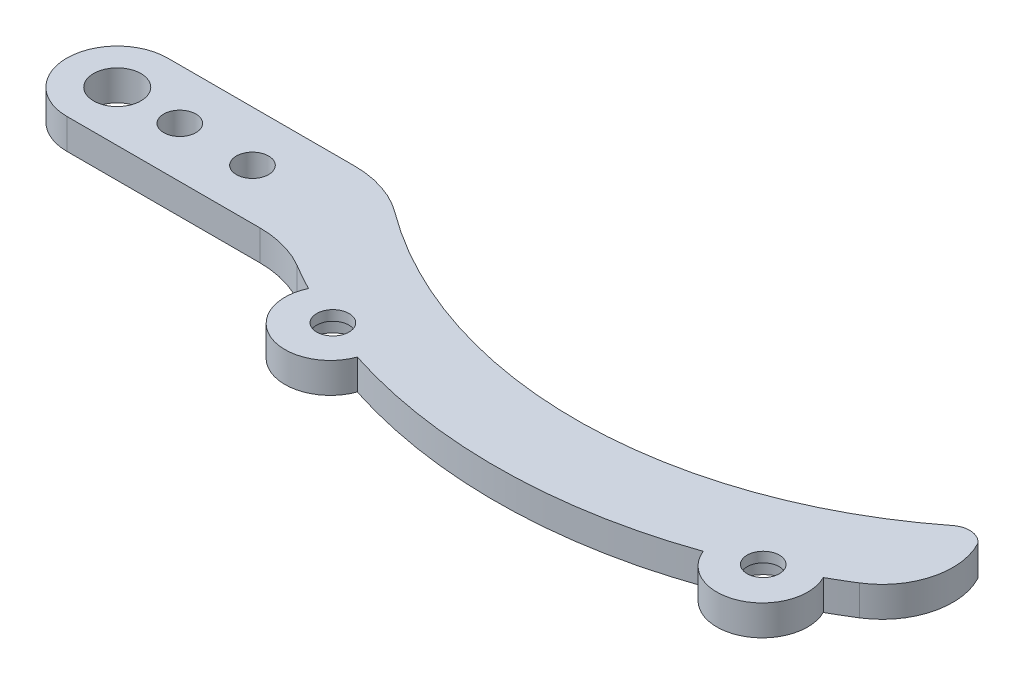
ISO-10303-21;
HEADER;
FILE_DESCRIPTION(('STEP AP214'),'2;1');
FILE_NAME('part.step','',(''),(''),'','','');
FILE_SCHEMA(('AUTOMOTIVE_DESIGN { 1 0 10303 214 1 1 1 1 }'));
ENDSEC;
DATA;
#1=APPLICATION_CONTEXT('core data for automotive mechanical design processes');
#2=APPLICATION_PROTOCOL_DEFINITION('international standard','automotive_design',2000,#1);
#3=PRODUCT_CONTEXT('',#1,'mechanical');
#4=PRODUCT('Part','Part','',(#3));
#5=PRODUCT_RELATED_PRODUCT_CATEGORY('part','',(#4));
#6=PRODUCT_DEFINITION_FORMATION('','',#4);
#7=PRODUCT_DEFINITION_CONTEXT('part definition',#1,'design');
#8=PRODUCT_DEFINITION('design','',#6,#7);
#9=PRODUCT_DEFINITION_SHAPE('','',#8);
#10=(LENGTH_UNIT() NAMED_UNIT(*) SI_UNIT(.MILLI.,.METRE.));
#11=(NAMED_UNIT(*) PLANE_ANGLE_UNIT() SI_UNIT($,.RADIAN.));
#12=(NAMED_UNIT(*) SI_UNIT($,.STERADIAN.) SOLID_ANGLE_UNIT());
#13=UNCERTAINTY_MEASURE_WITH_UNIT(LENGTH_MEASURE(1.E-05),#10,'distance_accuracy_value','');
#14=(GEOMETRIC_REPRESENTATION_CONTEXT(3) GLOBAL_UNCERTAINTY_ASSIGNED_CONTEXT((#13)) GLOBAL_UNIT_ASSIGNED_CONTEXT((#10,
#11,#12)) REPRESENTATION_CONTEXT('',''));
#15=CARTESIAN_POINT('',(0.,0.,0.));
#16=DIRECTION('',(0.,0.,1.));
#17=DIRECTION('',(1.,0.,0.));
#18=AXIS2_PLACEMENT_3D('',#15,#16,#17);
#19=CARTESIAN_POINT('',(1.89468168683698,-2.68774619760135,8.78806167188539));
#20=DIRECTION('',(0.,1.,0.));
#21=DIRECTION('',(0.,0.,-1.));
#22=AXIS2_PLACEMENT_3D('',#19,#20,#21);
#23=CYLINDRICAL_SURFACE('',#22,4.99999999999993);
#24=CARTESIAN_POINT('',(1.89468168683698,0.312253802398646,8.78806167188539));
#25=DIRECTION('',(0.,1.,0.));
#26=DIRECTION('',(0.,0.,1.));
#27=AXIS2_PLACEMENT_3D('',#24,#25,#26);
#28=CIRCLE('',#27,4.99999999999993);
#29=CARTESIAN_POINT('',(1.89468168683698,0.312253802398646,13.7880616718853));
#30=VERTEX_POINT('',#29);
#31=CARTESIAN_POINT('',(1.89468168683699,0.312253802398646,3.78806167188539));
#32=VERTEX_POINT('',#31);
#33=EDGE_CURVE('E208',#30,#32,#28,.F.);
#34=ORIENTED_EDGE('',*,*,#33,.T.);
#35=DIRECTION('',(0.,1.,0.));
#36=VECTOR('',#35,1.);
#37=CARTESIAN_POINT('',(1.89468168683699,-2.68774619760135,3.78806167188539));
#38=LINE('',#37,#36);
#39=CARTESIAN_POINT('',(1.89468168683699,-2.68774619760135,3.78806167188539));
#40=VERTEX_POINT('',#39);
#41=EDGE_CURVE('E166',#40,#32,#38,.T.);
#42=ORIENTED_EDGE('',*,*,#41,.F.);
#43=CARTESIAN_POINT('',(1.89468168683698,-2.68774619760135,8.78806167188539));
#44=DIRECTION('',(0.,1.,0.));
#45=DIRECTION('',(0.,0.,1.));
#46=AXIS2_PLACEMENT_3D('',#43,#44,#45);
#47=CIRCLE('',#46,4.99999999999993);
#48=CARTESIAN_POINT('',(1.89468168683698,-2.68774619760135,13.7880616718853));
#49=VERTEX_POINT('',#48);
#50=EDGE_CURVE('E143',#49,#40,#47,.F.);
#51=ORIENTED_EDGE('',*,*,#50,.F.);
#52=DIRECTION('',(0.,1.,0.));
#53=VECTOR('',#52,1.);
#54=CARTESIAN_POINT('',(1.89468168683698,-2.68774619760135,13.7880616718853));
#55=LINE('',#54,#53);
#56=EDGE_CURVE('E154',#49,#30,#55,.T.);
#57=ORIENTED_EDGE('',*,*,#56,.T.);
#58=EDGE_LOOP('',(#34,#42,#51,#57));
#59=FACE_BOUND('',#58,.T.);
#60=ADVANCED_FACE('F43',(#59),#23,.T.);
#61=CARTESIAN_POINT('',(0.,-2.68774619760135,13.7880616718853));
#62=DIRECTION('',(0.,0.,-1.));
#63=DIRECTION('',(1.,0.,0.));
#64=AXIS2_PLACEMENT_3D('',#61,#62,#63);
#65=PLANE('',#64);
#66=DIRECTION('',(1.,0.,0.));
#67=VECTOR('',#66,1.);
#68=CARTESIAN_POINT('',(0.,0.312253802398646,13.7880616718853));
#69=LINE('',#68,#67);
#70=CARTESIAN_POINT('',(21.026425844856,0.312253802398646,13.7880616718853));
#71=VERTEX_POINT('',#70);
#72=EDGE_CURVE('E157',#30,#71,#69,.T.);
#73=ORIENTED_EDGE('',*,*,#72,.F.);
#74=ORIENTED_EDGE('',*,*,#56,.F.);
#75=DIRECTION('',(1.,0.,0.));
#76=VECTOR('',#75,1.);
#77=CARTESIAN_POINT('',(0.,-2.68774619760135,13.7880616718853));
#78=LINE('',#77,#76);
#79=CARTESIAN_POINT('',(21.026425844856,-2.68774619760135,13.7880616718853));
#80=VERTEX_POINT('',#79);
#81=EDGE_CURVE('E137',#49,#80,#78,.T.);
#82=ORIENTED_EDGE('',*,*,#81,.T.);
#83=DIRECTION('',(0.,1.,0.));
#84=VECTOR('',#83,1.);
#85=CARTESIAN_POINT('',(21.026425844856,-2.68774619760135,13.7880616718853));
#86=LINE('',#85,#84);
#87=EDGE_CURVE('E262',#71,#80,#86,.F.);
#88=ORIENTED_EDGE('',*,*,#87,.F.);
#89=EDGE_LOOP('',(#73,#74,#82,#88));
#90=FACE_BOUND('',#89,.T.);
#91=ADVANCED_FACE('F155',(#90),#65,.F.);
#92=CARTESIAN_POINT('',(53.1412199435257,-2.68774619760135,-30.4119383281152));
#93=DIRECTION('',(0.,1.,0.));
#94=DIRECTION('',(0.,0.,-1.));
#95=AXIS2_PLACEMENT_3D('',#92,#93,#94);
#96=CYLINDRICAL_SURFACE('',#95,53.);
#97=CARTESIAN_POINT('',(53.1412199435257,-2.68774619760135,-30.4119383281152));
#98=DIRECTION('',(0.,1.,0.));
#99=DIRECTION('',(0.,0.,1.));
#100=AXIS2_PLACEMENT_3D('',#97,#98,#99);
#101=CIRCLE('',#100,53.);
#102=CARTESIAN_POINT('',(28.6425882264622,-2.68774619760135,16.5861152910688));
#103=VERTEX_POINT('',#102);
#104=CARTESIAN_POINT('',(26.1240122097242,-2.68774619760135,15.1848870687106));
#105=VERTEX_POINT('',#104);
#106=EDGE_CURVE('E151',#103,#105,#101,.F.);
#107=ORIENTED_EDGE('',*,*,#106,.F.);
#108=DIRECTION('',(0.,1.,0.));
#109=VECTOR('',#108,1.);
#110=CARTESIAN_POINT('',(28.6425882264622,-2.68774619760135,16.5861152910688));
#111=LINE('',#110,#109);
#112=CARTESIAN_POINT('',(28.6425882264622,0.312253802398646,16.5861152910688));
#113=VERTEX_POINT('',#112);
#114=EDGE_CURVE('E163',#103,#113,#111,.T.);
#115=ORIENTED_EDGE('',*,*,#114,.T.);
#116=CARTESIAN_POINT('',(53.1412199435257,0.312253802398646,-30.4119383281152));
#117=DIRECTION('',(0.,1.,0.));
#118=DIRECTION('',(0.,0.,1.));
#119=AXIS2_PLACEMENT_3D('',#116,#117,#118);
#120=CIRCLE('',#119,53.);
#121=CARTESIAN_POINT('',(26.1240122097242,0.312253802398646,15.1848870687106));
#122=VERTEX_POINT('',#121);
#123=EDGE_CURVE('E214',#113,#122,#120,.F.);
#124=ORIENTED_EDGE('',*,*,#123,.T.);
#125=DIRECTION('',(0.,1.,0.));
#126=VECTOR('',#125,1.);
#127=CARTESIAN_POINT('',(26.1240122097242,-2.68774619760135,15.1848870687106));
#128=LINE('',#127,#126);
#129=EDGE_CURVE('E162',#105,#122,#128,.T.);
#130=ORIENTED_EDGE('',*,*,#129,.F.);
#131=EDGE_LOOP('',(#107,#115,#124,#130));
#132=FACE_BOUND('',#131,.T.);
#133=ADVANCED_FACE('F322',(#132),#96,.T.);
#134=CARTESIAN_POINT('',(32.7176965131315,-2.68774619760135,18.4949087455629));
#135=DIRECTION('',(0.,1.,0.));
#136=DIRECTION('',(0.,0.,-1.));
#137=AXIS2_PLACEMENT_3D('',#134,#135,#136);
#138=CYLINDRICAL_SURFACE('',#137,4.5);
#139=CARTESIAN_POINT('',(32.7176965131315,0.312253802398646,18.4949087455629));
#140=DIRECTION('',(0.,1.,0.));
#141=DIRECTION('',(0.,0.,1.));
#142=AXIS2_PLACEMENT_3D('',#139,#140,#141);
#143=CIRCLE('',#142,4.5);
#144=CARTESIAN_POINT('',(36.9400373912801,0.312253802398646,20.0511341497751));
#145=VERTEX_POINT('',#144);
#146=EDGE_CURVE('E218',#145,#113,#143,.F.);
#147=ORIENTED_EDGE('',*,*,#146,.T.);
#148=ORIENTED_EDGE('',*,*,#114,.F.);
#149=CARTESIAN_POINT('',(32.7176965131315,-2.68774619760135,18.4949087455629));
#150=DIRECTION('',(0.,1.,0.));
#151=DIRECTION('',(0.,0.,1.));
#152=AXIS2_PLACEMENT_3D('',#149,#150,#151);
#153=CIRCLE('',#152,4.5);
#154=CARTESIAN_POINT('',(36.9400373912801,-2.68774619760135,20.0511341497751));
#155=VERTEX_POINT('',#154);
#156=EDGE_CURVE('E180',#155,#103,#153,.F.);
#157=ORIENTED_EDGE('',*,*,#156,.F.);
#158=DIRECTION('',(0.,1.,0.));
#159=VECTOR('',#158,1.);
#160=CARTESIAN_POINT('',(36.9400373912801,-2.68774619760135,20.0511341497751));
#161=LINE('',#160,#159);
#162=EDGE_CURVE('E252',#155,#145,#161,.T.);
#163=ORIENTED_EDGE('',*,*,#162,.T.);
#164=EDGE_LOOP('',(#147,#148,#157,#163));
#165=FACE_BOUND('',#164,.T.);
#166=ADVANCED_FACE('F317',(#165),#138,.T.);
#167=CARTESIAN_POINT('',(70.7450649674562,0.312253802398646,19.5791072738067));
#168=VERTEX_POINT('',#167);
#169=EDGE_CURVE('E220',#168,#145,#120,.F.);
#170=ORIENTED_EDGE('',*,*,#169,.T.);
#171=ORIENTED_EDGE('',*,*,#162,.F.);
#172=CARTESIAN_POINT('',(70.7450649674562,-2.68774619760135,19.5791072738067));
#173=VERTEX_POINT('',#172);
#174=EDGE_CURVE('E182',#173,#155,#101,.F.);
#175=ORIENTED_EDGE('',*,*,#174,.F.);
#176=DIRECTION('',(0.,1.,0.));
#177=VECTOR('',#176,1.);
#178=CARTESIAN_POINT('',(70.7450649674562,-2.68774619760135,19.5791072738067));
#179=LINE('',#178,#177);
#180=EDGE_CURVE('E248',#173,#168,#179,.T.);
#181=ORIENTED_EDGE('',*,*,#180,.T.);
#182=EDGE_LOOP('',(#170,#171,#175,#181));
#183=FACE_BOUND('',#182,.T.);
#184=ADVANCED_FACE('F313',(#183),#96,.T.);
#185=CARTESIAN_POINT('',(74.922308346537,-2.68774619760135,17.905596666752));
#186=DIRECTION('',(0.,1.,0.));
#187=DIRECTION('',(0.,0.,-1.));
#188=AXIS2_PLACEMENT_3D('',#185,#186,#187);
#189=CYLINDRICAL_SURFACE('',#188,4.5);
#190=CARTESIAN_POINT('',(74.922308346537,0.312253802398646,17.905596666752));
#191=DIRECTION('',(0.,1.,0.));
#192=DIRECTION('',(0.,0.,1.));
#193=AXIS2_PLACEMENT_3D('',#190,#191,#192);
#194=CIRCLE('',#193,4.5);
#195=CARTESIAN_POINT('',(78.9425324873975,0.312253802398646,15.8837663431979));
#196=VERTEX_POINT('',#195);
#197=EDGE_CURVE('E223',#168,#196,#194,.T.);
#198=ORIENTED_EDGE('',*,*,#197,.F.);
#199=ORIENTED_EDGE('',*,*,#180,.F.);
#200=CARTESIAN_POINT('',(74.922308346537,-2.68774619760135,17.905596666752));
#201=DIRECTION('',(0.,1.,0.));
#202=DIRECTION('',(0.,0.,1.));
#203=AXIS2_PLACEMENT_3D('',#200,#201,#202);
#204=CIRCLE('',#203,4.5);
#205=CARTESIAN_POINT('',(78.9425324873975,-2.68774619760135,15.8837663431979));
#206=VERTEX_POINT('',#205);
#207=EDGE_CURVE('E185',#173,#206,#204,.T.);
#208=ORIENTED_EDGE('',*,*,#207,.T.);
#209=DIRECTION('',(0.,1.,0.));
#210=VECTOR('',#209,1.);
#211=CARTESIAN_POINT('',(78.9425324873975,-2.68774619760135,15.8837663431979));
#212=LINE('',#211,#210);
#213=EDGE_CURVE('E244',#206,#196,#212,.T.);
#214=ORIENTED_EDGE('',*,*,#213,.T.);
#215=EDGE_LOOP('',(#198,#199,#208,#214));
#216=FACE_BOUND('',#215,.T.);
#217=ADVANCED_FACE('F438',(#216),#189,.T.);
#218=CARTESIAN_POINT('',(81.2107590333428,0.312253802398646,14.5447183011898));
#219=VERTEX_POINT('',#218);
#220=EDGE_CURVE('E219',#219,#196,#120,.F.);
#221=ORIENTED_EDGE('',*,*,#220,.T.);
#222=ORIENTED_EDGE('',*,*,#213,.F.);
#223=CARTESIAN_POINT('',(81.2107590333428,-2.68774619760135,14.5447183011898));
#224=VERTEX_POINT('',#223);
#225=EDGE_CURVE('E181',#224,#206,#101,.F.);
#226=ORIENTED_EDGE('',*,*,#225,.F.);
#227=DIRECTION('',(0.,1.,0.));
#228=VECTOR('',#227,1.);
#229=CARTESIAN_POINT('',(81.2107590333428,-2.68774619760135,14.5447183011898));
#230=LINE('',#229,#228);
#231=EDGE_CURVE('E52',#219,#224,#230,.F.);
#232=ORIENTED_EDGE('',*,*,#231,.F.);
#233=EDGE_LOOP('',(#221,#222,#226,#232));
#234=FACE_BOUND('',#233,.T.);
#235=ADVANCED_FACE('F304',(#234),#96,.T.);
#236=CARTESIAN_POINT('',(53.1412199435257,-2.68774619760135,-30.4119383281152));
#237=DIRECTION('',(0.,1.,0.));
#238=DIRECTION('',(0.,0.,-1.));
#239=AXIS2_PLACEMENT_3D('',#236,#237,#238);
#240=CYLINDRICAL_SURFACE('',#239,45.);
#241=CARTESIAN_POINT('',(53.1412199435257,-2.68774619760135,-30.4119383281152));
#242=DIRECTION('',(0.,1.,0.));
#243=DIRECTION('',(0.,0.,1.));
#244=AXIS2_PLACEMENT_3D('',#241,#242,#243);
#245=CIRCLE('',#244,45.);
#246=CARTESIAN_POINT('',(80.9059476162616,-2.68774619760135,5.0016169474966));
#247=VERTEX_POINT('',#246);
#248=CARTESIAN_POINT('',(26.360790429445,-2.68774619760135,5.75169803552164));
#249=VERTEX_POINT('',#248);
#250=EDGE_CURVE('E189',#247,#249,#245,.F.);
#251=ORIENTED_EDGE('',*,*,#250,.T.);
#252=DIRECTION('',(0.,1.,0.));
#253=VECTOR('',#252,1.);
#254=CARTESIAN_POINT('',(26.3607904294451,-2.68774619760135,5.75169803552164));
#255=LINE('',#254,#253);
#256=CARTESIAN_POINT('',(26.360790429445,0.312253802398646,5.75169803552164));
#257=VERTEX_POINT('',#256);
#258=EDGE_CURVE('E272',#257,#249,#255,.F.);
#259=ORIENTED_EDGE('',*,*,#258,.F.);
#260=CARTESIAN_POINT('',(53.1412199435257,0.312253802398646,-30.4119383281152));
#261=DIRECTION('',(0.,1.,0.));
#262=DIRECTION('',(0.,0.,1.));
#263=AXIS2_PLACEMENT_3D('',#260,#261,#262);
#264=CIRCLE('',#263,45.);
#265=CARTESIAN_POINT('',(80.9059476162616,0.312253802398646,5.0016169474966));
#266=VERTEX_POINT('',#265);
#267=EDGE_CURVE('E227',#266,#257,#264,.F.);
#268=ORIENTED_EDGE('',*,*,#267,.F.);
#269=DIRECTION('',(0.,1.,0.));
#270=VECTOR('',#269,1.);
#271=CARTESIAN_POINT('',(80.9059476162616,-2.68774619760135,5.0016169474966));
#272=LINE('',#271,#270);
#273=EDGE_CURVE('E284',#247,#266,#272,.T.);
#274=ORIENTED_EDGE('',*,*,#273,.F.);
#275=EDGE_LOOP('',(#251,#259,#268,#274));
#276=FACE_BOUND('',#275,.T.);
#277=ADVANCED_FACE('F338',(#276),#240,.F.);
#278=CARTESIAN_POINT('',(8.09468168683698,-2.68774619760135,8.78806167188533));
#279=DIRECTION('',(0.,1.,0.));
#280=DIRECTION('',(0.,0.,-1.));
#281=AXIS2_PLACEMENT_3D('',#278,#279,#280);
#282=CYLINDRICAL_SURFACE('',#281,1.6);
#283=CARTESIAN_POINT('',(8.09468168683698,-2.68774619760135,8.78806167188533));
#284=DIRECTION('',(0.,1.,0.));
#285=DIRECTION('',(0.,0.,1.));
#286=AXIS2_PLACEMENT_3D('',#283,#284,#285);
#287=CIRCLE('',#286,1.6);
#288=CARTESIAN_POINT('',(8.09468168683698,-2.68774619760135,10.3880616718853));
#289=VERTEX_POINT('',#288);
#290=EDGE_CURVE('E200',#289,#289,#287,.T.);
#291=ORIENTED_EDGE('',*,*,#290,.F.);
#292=EDGE_LOOP('',(#291));
#293=FACE_BOUND('',#292,.T.);
#294=CARTESIAN_POINT('',(8.09468168683698,0.312253802398646,8.78806167188533));
#295=DIRECTION('',(0.,1.,0.));
#296=DIRECTION('',(0.,0.,1.));
#297=AXIS2_PLACEMENT_3D('',#294,#295,#296);
#298=CIRCLE('',#297,1.6);
#299=CARTESIAN_POINT('',(8.09468168683698,0.312253802398646,10.3880616718853));
#300=VERTEX_POINT('',#299);
#301=EDGE_CURVE('E172',#300,#300,#298,.T.);
#302=ORIENTED_EDGE('',*,*,#301,.T.);
#303=EDGE_LOOP('',(#302));
#304=FACE_BOUND('',#303,.T.);
#305=ADVANCED_FACE('F424',(#293,#304),#282,.F.);
#306=CARTESIAN_POINT('',(15.294681686837,-2.68774619760135,8.78806167188539));
#307=DIRECTION('',(0.,1.,0.));
#308=DIRECTION('',(0.,0.,-1.));
#309=AXIS2_PLACEMENT_3D('',#306,#307,#308);
#310=CYLINDRICAL_SURFACE('',#309,1.6);
#311=CARTESIAN_POINT('',(15.294681686837,-2.68774619760135,8.78806167188539));
#312=DIRECTION('',(0.,1.,0.));
#313=DIRECTION('',(0.,0.,1.));
#314=AXIS2_PLACEMENT_3D('',#311,#312,#313);
#315=CIRCLE('',#314,1.6);
#316=CARTESIAN_POINT('',(15.294681686837,-2.68774619760135,10.3880616718854));
#317=VERTEX_POINT('',#316);
#318=EDGE_CURVE('E196',#317,#317,#315,.T.);
#319=ORIENTED_EDGE('',*,*,#318,.F.);
#320=EDGE_LOOP('',(#319));
#321=FACE_BOUND('',#320,.T.);
#322=CARTESIAN_POINT('',(15.294681686837,0.312253802398646,8.78806167188539));
#323=DIRECTION('',(0.,1.,0.));
#324=DIRECTION('',(0.,0.,1.));
#325=AXIS2_PLACEMENT_3D('',#322,#323,#324);
#326=CIRCLE('',#325,1.6);
#327=CARTESIAN_POINT('',(15.294681686837,0.312253802398646,10.3880616718854));
#328=VERTEX_POINT('',#327);
#329=EDGE_CURVE('E235',#328,#328,#326,.T.);
#330=ORIENTED_EDGE('',*,*,#329,.T.);
#331=EDGE_LOOP('',(#330));
#332=FACE_BOUND('',#331,.T.);
#333=ADVANCED_FACE('F427',(#321,#332),#310,.F.);
#334=CARTESIAN_POINT('',(0.,-2.68774619760135,3.78806167188539));
#335=DIRECTION('',(0.,0.,-1.));
#336=DIRECTION('',(1.,0.,0.));
#337=AXIS2_PLACEMENT_3D('',#334,#335,#336);
#338=PLANE('',#337);
#339=DIRECTION('',(1.,0.,0.));
#340=VECTOR('',#339,1.);
#341=CARTESIAN_POINT('',(0.,-2.68774619760135,3.78806167188539));
#342=LINE('',#341,#340);
#343=CARTESIAN_POINT('',(20.4095838707605,-2.68774619760135,3.78806167188539));
#344=VERTEX_POINT('',#343);
#345=EDGE_CURVE('E193',#40,#344,#342,.T.);
#346=ORIENTED_EDGE('',*,*,#345,.F.);
#347=ORIENTED_EDGE('',*,*,#41,.T.);
#348=DIRECTION('',(1.,0.,0.));
#349=VECTOR('',#348,1.);
#350=CARTESIAN_POINT('',(0.,0.312253802398646,3.78806167188539));
#351=LINE('',#350,#349);
#352=CARTESIAN_POINT('',(20.4095838707605,0.312253802398646,3.78806167188539));
#353=VERTEX_POINT('',#352);
#354=EDGE_CURVE('E231',#32,#353,#351,.T.);
#355=ORIENTED_EDGE('',*,*,#354,.T.);
#356=DIRECTION('',(0.,-1.,0.));
#357=VECTOR('',#356,1.);
#358=CARTESIAN_POINT('',(20.4095838707605,0.312253802398646,3.78806167188539));
#359=LINE('',#358,#357);
#360=EDGE_CURVE('E265',#344,#353,#359,.F.);
#361=ORIENTED_EDGE('',*,*,#360,.F.);
#362=EDGE_LOOP('',(#346,#347,#355,#361));
#363=FACE_BOUND('',#362,.T.);
#364=ADVANCED_FACE('F330',(#363),#338,.T.);
#365=CARTESIAN_POINT('',(1.89468168683698,-2.68774619760135,8.78806167188539));
#366=DIRECTION('',(0.,1.,0.));
#367=DIRECTION('',(0.,0.,-1.));
#368=AXIS2_PLACEMENT_3D('',#365,#366,#367);
#369=CYLINDRICAL_SURFACE('',#368,2.35);
#370=CARTESIAN_POINT('',(1.89468168683698,-2.68774619760135,8.78806167188539));
#371=DIRECTION('',(0.,1.,0.));
#372=DIRECTION('',(0.,0.,1.));
#373=AXIS2_PLACEMENT_3D('',#370,#371,#372);
#374=CIRCLE('',#373,2.35);
#375=CARTESIAN_POINT('',(1.89468168683698,-2.68774619760135,11.1380616718854));
#376=VERTEX_POINT('',#375);
#377=EDGE_CURVE('E204',#376,#376,#374,.F.);
#378=ORIENTED_EDGE('',*,*,#377,.T.);
#379=EDGE_LOOP('',(#378));
#380=FACE_BOUND('',#379,.T.);
#381=CARTESIAN_POINT('',(1.89468168683698,0.312253802398646,8.78806167188539));
#382=DIRECTION('',(0.,1.,0.));
#383=DIRECTION('',(0.,0.,1.));
#384=AXIS2_PLACEMENT_3D('',#381,#382,#383);
#385=CIRCLE('',#384,2.35);
#386=CARTESIAN_POINT('',(1.89468168683698,0.312253802398646,11.1380616718854));
#387=VERTEX_POINT('',#386);
#388=EDGE_CURVE('E168',#387,#387,#385,.F.);
#389=ORIENTED_EDGE('',*,*,#388,.F.);
#390=EDGE_LOOP('',(#389));
#391=FACE_BOUND('',#390,.T.);
#392=ADVANCED_FACE('F417',(#380,#391),#369,.F.);
#393=CARTESIAN_POINT('',(0.,-2.68774619760135,7.57612334377077));
#394=DIRECTION('',(0.,-1.,0.));
#395=DIRECTION('',(0.,0.,1.));
#396=AXIS2_PLACEMENT_3D('',#393,#394,#395);
#397=PLANE('',#396);
#398=CARTESIAN_POINT('',(32.7913128088711,-2.68774619760135,18.3186247204219));
#399=DIRECTION('',(0.,1.,0.));
#400=DIRECTION('',(0.,0.,1.));
#401=AXIS2_PLACEMENT_3D('',#398,#399,#400);
#402=CIRCLE('',#401,3.);
#403=CARTESIAN_POINT('',(32.7913128088711,-2.68774619760135,21.3186247204219));
#404=VERTEX_POINT('',#403);
#405=EDGE_CURVE('E367',#404,#404,#402,.T.);
#406=ORIENTED_EDGE('',*,*,#405,.T.);
#407=EDGE_LOOP('',(#406));
#408=FACE_BOUND('',#407,.T.);
#409=CARTESIAN_POINT('',(74.8437987274268,-2.68774619760135,17.7314368085023));
#410=DIRECTION('',(0.,1.,0.));
#411=DIRECTION('',(0.,0.,1.));
#412=AXIS2_PLACEMENT_3D('',#409,#410,#411);
#413=CIRCLE('',#412,3.);
#414=CARTESIAN_POINT('',(74.8437987274268,-2.68774619760135,20.7314368085023));
#415=VERTEX_POINT('',#414);
#416=EDGE_CURVE('E352',#415,#415,#413,.T.);
#417=ORIENTED_EDGE('',*,*,#416,.T.);
#418=EDGE_LOOP('',(#417));
#419=FACE_BOUND('',#418,.T.);
#420=ORIENTED_EDGE('',*,*,#225,.T.);
#421=ORIENTED_EDGE('',*,*,#207,.F.);
#422=ORIENTED_EDGE('',*,*,#174,.T.);
#423=ORIENTED_EDGE('',*,*,#156,.T.);
#424=ORIENTED_EDGE('',*,*,#106,.T.);
#425=CARTESIAN_POINT('',(21.026425844856,-2.68774619760135,23.7880616718853));
#426=DIRECTION('',(0.,1.,0.));
#427=DIRECTION('',(0.,0.,1.));
#428=AXIS2_PLACEMENT_3D('',#425,#426,#427);
#429=CIRCLE('',#428,10.);
#430=EDGE_CURVE('E146',#80,#105,#429,.F.);
#431=ORIENTED_EDGE('',*,*,#430,.F.);
#432=ORIENTED_EDGE('',*,*,#81,.F.);
#433=ORIENTED_EDGE('',*,*,#50,.T.);
#434=ORIENTED_EDGE('',*,*,#345,.T.);
#435=CARTESIAN_POINT('',(20.4095838707605,-2.68774619760135,13.7880616718854));
#436=DIRECTION('',(0.,1.,0.));
#437=DIRECTION('',(0.,0.,1.));
#438=AXIS2_PLACEMENT_3D('',#435,#436,#437);
#439=CIRCLE('',#438,10.);
#440=EDGE_CURVE('E276',#249,#344,#439,.T.);
#441=ORIENTED_EDGE('',*,*,#440,.F.);
#442=ORIENTED_EDGE('',*,*,#250,.F.);
#443=CARTESIAN_POINT('',(82.1399355128277,-2.68774619760135,6.5755527375238));
#444=DIRECTION('',(0.,1.,0.));
#445=DIRECTION('',(0.,0.,1.));
#446=AXIS2_PLACEMENT_3D('',#443,#444,#445);
#447=CIRCLE('',#446,2.);
#448=CARTESIAN_POINT('',(83.6599355128277,-2.68774619760135,5.27570659278209));
#449=VERTEX_POINT('',#448);
#450=EDGE_CURVE('E295',#449,#247,#447,.T.);
#451=ORIENTED_EDGE('',*,*,#450,.F.);
#452=CARTESIAN_POINT('',(77.5034614177066,-2.68774619760135,8.6070466709042));
#453=DIRECTION('',(0.,1.,0.));
#454=DIRECTION('',(0.,0.,1.));
#455=AXIS2_PLACEMENT_3D('',#452,#453,#454);
#456=CIRCLE('',#455,7.);
#457=EDGE_CURVE('E11',#224,#449,#456,.T.);
#458=ORIENTED_EDGE('',*,*,#457,.F.);
#459=EDGE_LOOP('',(#420,#421,#422,#423,#424,#431,#432,#433,#434,#441,#442,#451,#458));
#460=FACE_BOUND('',#459,.T.);
#461=ORIENTED_EDGE('',*,*,#318,.T.);
#462=EDGE_LOOP('',(#461));
#463=FACE_BOUND('',#462,.T.);
#464=ORIENTED_EDGE('',*,*,#290,.T.);
#465=EDGE_LOOP('',(#464));
#466=FACE_BOUND('',#465,.T.);
#467=ORIENTED_EDGE('',*,*,#377,.F.);
#468=EDGE_LOOP('',(#467));
#469=FACE_BOUND('',#468,.T.);
#470=ADVANCED_FACE('F139',(#408,#419,#460,#463,#466,#469),#397,.T.);
#471=CARTESIAN_POINT('',(0.,0.312253802398646,7.57612334377077));
#472=DIRECTION('',(0.,-1.,0.));
#473=DIRECTION('',(0.,0.,1.));
#474=AXIS2_PLACEMENT_3D('',#471,#472,#473);
#475=PLANE('',#474);
#476=CARTESIAN_POINT('',(32.7913128088711,0.312253802398646,18.3186247204219));
#477=DIRECTION('',(0.,1.,0.));
#478=DIRECTION('',(0.,0.,1.));
#479=AXIS2_PLACEMENT_3D('',#476,#477,#478);
#480=CIRCLE('',#479,1.6);
#481=CARTESIAN_POINT('',(32.7913128088711,0.312253802398646,19.9186247204219));
#482=VERTEX_POINT('',#481);
#483=EDGE_CURVE('E355',#482,#482,#480,.F.);
#484=ORIENTED_EDGE('',*,*,#483,.T.);
#485=EDGE_LOOP('',(#484));
#486=FACE_BOUND('',#485,.T.);
#487=CARTESIAN_POINT('',(74.8437987274268,0.312253802398646,17.7314368085023));
#488=DIRECTION('',(0.,1.,0.));
#489=DIRECTION('',(0.,0.,1.));
#490=AXIS2_PLACEMENT_3D('',#487,#488,#489);
#491=CIRCLE('',#490,1.6);
#492=CARTESIAN_POINT('',(74.8437987274268,0.312253802398646,19.3314368085023));
#493=VERTEX_POINT('',#492);
#494=EDGE_CURVE('E211',#493,#493,#491,.F.);
#495=ORIENTED_EDGE('',*,*,#494,.T.);
#496=EDGE_LOOP('',(#495));
#497=FACE_BOUND('',#496,.T.);
#498=CARTESIAN_POINT('',(82.1399355128277,0.312253802398646,6.5755527375238));
#499=DIRECTION('',(0.,1.,0.));
#500=DIRECTION('',(0.,0.,1.));
#501=AXIS2_PLACEMENT_3D('',#498,#499,#500);
#502=CIRCLE('',#501,2.);
#503=CARTESIAN_POINT('',(83.6599355128277,0.312253802398646,5.27570659278209));
#504=VERTEX_POINT('',#503);
#505=EDGE_CURVE('E288',#266,#504,#502,.F.);
#506=ORIENTED_EDGE('',*,*,#505,.F.);
#507=ORIENTED_EDGE('',*,*,#267,.T.);
#508=CARTESIAN_POINT('',(20.4095838707605,0.312253802398646,13.7880616718854));
#509=DIRECTION('',(0.,1.,0.));
#510=DIRECTION('',(0.,0.,1.));
#511=AXIS2_PLACEMENT_3D('',#508,#509,#510);
#512=CIRCLE('',#511,10.);
#513=EDGE_CURVE('E269',#353,#257,#512,.F.);
#514=ORIENTED_EDGE('',*,*,#513,.F.);
#515=ORIENTED_EDGE('',*,*,#354,.F.);
#516=ORIENTED_EDGE('',*,*,#33,.F.);
#517=ORIENTED_EDGE('',*,*,#72,.T.);
#518=CARTESIAN_POINT('',(21.026425844856,0.312253802398646,23.7880616718853));
#519=DIRECTION('',(0.,1.,0.));
#520=DIRECTION('',(0.,0.,1.));
#521=AXIS2_PLACEMENT_3D('',#518,#519,#520);
#522=CIRCLE('',#521,10.);
#523=EDGE_CURVE('E279',#122,#71,#522,.T.);
#524=ORIENTED_EDGE('',*,*,#523,.F.);
#525=ORIENTED_EDGE('',*,*,#123,.F.);
#526=ORIENTED_EDGE('',*,*,#146,.F.);
#527=ORIENTED_EDGE('',*,*,#169,.F.);
#528=ORIENTED_EDGE('',*,*,#197,.T.);
#529=ORIENTED_EDGE('',*,*,#220,.F.);
#530=CARTESIAN_POINT('',(77.5034614177066,0.312253802398646,8.6070466709042));
#531=DIRECTION('',(0.,1.,0.));
#532=DIRECTION('',(0.,0.,1.));
#533=AXIS2_PLACEMENT_3D('',#530,#531,#532);
#534=CIRCLE('',#533,7.);
#535=EDGE_CURVE('E64',#504,#219,#534,.F.);
#536=ORIENTED_EDGE('',*,*,#535,.F.);
#537=EDGE_LOOP('',(#506,#507,#514,#515,#516,#517,#524,#525,#526,#527,#528,#529,#536));
#538=FACE_BOUND('',#537,.T.);
#539=ORIENTED_EDGE('',*,*,#329,.F.);
#540=EDGE_LOOP('',(#539));
#541=FACE_BOUND('',#540,.T.);
#542=ORIENTED_EDGE('',*,*,#301,.F.);
#543=EDGE_LOOP('',(#542));
#544=FACE_BOUND('',#543,.T.);
#545=ORIENTED_EDGE('',*,*,#388,.T.);
#546=EDGE_LOOP('',(#545));
#547=FACE_BOUND('',#546,.T.);
#548=ADVANCED_FACE('F326',(#486,#497,#538,#541,#544,#547),#475,.F.);
#549=CARTESIAN_POINT('',(21.026425844856,-2.68774619760135,23.7880616718853));
#550=DIRECTION('',(0.,1.,0.));
#551=DIRECTION('',(0.,0.,-1.));
#552=AXIS2_PLACEMENT_3D('',#549,#550,#551);
#553=CYLINDRICAL_SURFACE('',#552,10.);
#554=ORIENTED_EDGE('',*,*,#430,.T.);
#555=ORIENTED_EDGE('',*,*,#129,.T.);
#556=ORIENTED_EDGE('',*,*,#523,.T.);
#557=ORIENTED_EDGE('',*,*,#87,.T.);
#558=EDGE_LOOP('',(#554,#555,#556,#557));
#559=FACE_BOUND('',#558,.T.);
#560=ADVANCED_FACE('F324',(#559),#553,.F.);
#561=CARTESIAN_POINT('',(20.4095838707605,-2.68774619760135,13.7880616718854));
#562=DIRECTION('',(0.,1.,0.));
#563=DIRECTION('',(0.,0.,-1.));
#564=AXIS2_PLACEMENT_3D('',#561,#562,#563);
#565=CYLINDRICAL_SURFACE('',#564,10.);
#566=ORIENTED_EDGE('',*,*,#440,.T.);
#567=ORIENTED_EDGE('',*,*,#360,.T.);
#568=ORIENTED_EDGE('',*,*,#513,.T.);
#569=ORIENTED_EDGE('',*,*,#258,.T.);
#570=EDGE_LOOP('',(#566,#567,#568,#569));
#571=FACE_BOUND('',#570,.T.);
#572=ADVANCED_FACE('F334',(#571),#565,.T.);
#573=CARTESIAN_POINT('',(74.8437987274268,-2.68774619760135,17.7314368085023));
#574=DIRECTION('',(0.,-1.,0.));
#575=DIRECTION('',(0.,0.,1.));
#576=AXIS2_PLACEMENT_3D('',#573,#574,#575);
#577=CYLINDRICAL_SURFACE('',#576,1.6);
#578=ORIENTED_EDGE('',*,*,#494,.F.);
#579=EDGE_LOOP('',(#578));
#580=FACE_BOUND('',#579,.T.);
#581=CARTESIAN_POINT('',(74.8437987274268,-0.687746197601352,17.7314368085023));
#582=DIRECTION('',(0.,1.,0.));
#583=DIRECTION('',(0.,0.,1.));
#584=AXIS2_PLACEMENT_3D('',#581,#582,#583);
#585=CIRCLE('',#584,1.6);
#586=CARTESIAN_POINT('',(74.8437987274268,-0.687746197601352,19.3314368085023));
#587=VERTEX_POINT('',#586);
#588=EDGE_CURVE('E175',#587,#587,#585,.T.);
#589=ORIENTED_EDGE('',*,*,#588,.F.);
#590=EDGE_LOOP('',(#589));
#591=FACE_BOUND('',#590,.T.);
#592=ADVANCED_FACE('F398',(#580,#591),#577,.F.);
#593=CARTESIAN_POINT('',(76.4437987274268,-0.687746197601352,17.7314368085023));
#594=DIRECTION('',(0.,1.,0.));
#595=DIRECTION('',(0.,0.,-1.));
#596=AXIS2_PLACEMENT_3D('',#593,#594,#595);
#597=PLANE('',#596);
#598=ORIENTED_EDGE('',*,*,#588,.T.);
#599=EDGE_LOOP('',(#598));
#600=FACE_BOUND('',#599,.T.);
#601=CARTESIAN_POINT('',(74.8437987274268,-0.687746197601352,17.7314368085023));
#602=DIRECTION('',(0.,1.,0.));
#603=DIRECTION('',(0.,0.,1.));
#604=AXIS2_PLACEMENT_3D('',#601,#602,#603);
#605=CIRCLE('',#604,3.);
#606=CARTESIAN_POINT('',(74.8437987274268,-0.687746197601352,20.7314368085023));
#607=VERTEX_POINT('',#606);
#608=EDGE_CURVE('E349',#607,#607,#605,.T.);
#609=ORIENTED_EDGE('',*,*,#608,.F.);
#610=EDGE_LOOP('',(#609));
#611=FACE_BOUND('',#610,.T.);
#612=ADVANCED_FACE('F402',(#600,#611),#597,.F.);
#613=CARTESIAN_POINT('',(74.8437987274268,-2.68774619760135,17.7314368085023));
#614=DIRECTION('',(0.,-1.,0.));
#615=DIRECTION('',(0.,0.,1.));
#616=AXIS2_PLACEMENT_3D('',#613,#614,#615);
#617=CYLINDRICAL_SURFACE('',#616,3.);
#618=ORIENTED_EDGE('',*,*,#608,.T.);
#619=EDGE_LOOP('',(#618));
#620=FACE_BOUND('',#619,.T.);
#621=ORIENTED_EDGE('',*,*,#416,.F.);
#622=EDGE_LOOP('',(#621));
#623=FACE_BOUND('',#622,.T.);
#624=ADVANCED_FACE('F408',(#620,#623),#617,.F.);
#625=CARTESIAN_POINT('',(32.7913128088711,-2.68774619760135,18.3186247204219));
#626=DIRECTION('',(0.,-1.,0.));
#627=DIRECTION('',(0.,0.,1.));
#628=AXIS2_PLACEMENT_3D('',#625,#626,#627);
#629=CYLINDRICAL_SURFACE('',#628,1.6);
#630=ORIENTED_EDGE('',*,*,#483,.F.);
#631=EDGE_LOOP('',(#630));
#632=FACE_BOUND('',#631,.T.);
#633=CARTESIAN_POINT('',(32.7913128088711,-0.687746197601352,18.3186247204219));
#634=DIRECTION('',(0.,1.,0.));
#635=DIRECTION('',(0.,0.,1.));
#636=AXIS2_PLACEMENT_3D('',#633,#634,#635);
#637=CIRCLE('',#636,1.6);
#638=CARTESIAN_POINT('',(32.7913128088711,-0.687746197601352,19.9186247204219));
#639=VERTEX_POINT('',#638);
#640=EDGE_CURVE('E359',#639,#639,#637,.T.);
#641=ORIENTED_EDGE('',*,*,#640,.F.);
#642=EDGE_LOOP('',(#641));
#643=FACE_BOUND('',#642,.T.);
#644=ADVANCED_FACE('F384',(#632,#643),#629,.F.);
#645=CARTESIAN_POINT('',(34.3913128088711,-0.687746197601352,18.3186247204219));
#646=DIRECTION('',(0.,1.,0.));
#647=DIRECTION('',(0.,0.,-1.));
#648=AXIS2_PLACEMENT_3D('',#645,#646,#647);
#649=PLANE('',#648);
#650=ORIENTED_EDGE('',*,*,#640,.T.);
#651=EDGE_LOOP('',(#650));
#652=FACE_BOUND('',#651,.T.);
#653=CARTESIAN_POINT('',(32.7913128088711,-0.687746197601352,18.3186247204219));
#654=DIRECTION('',(0.,1.,0.));
#655=DIRECTION('',(0.,0.,1.));
#656=AXIS2_PLACEMENT_3D('',#653,#654,#655);
#657=CIRCLE('',#656,3.);
#658=CARTESIAN_POINT('',(32.7913128088711,-0.687746197601352,21.3186247204219));
#659=VERTEX_POINT('',#658);
#660=EDGE_CURVE('E363',#659,#659,#657,.T.);
#661=ORIENTED_EDGE('',*,*,#660,.F.);
#662=EDGE_LOOP('',(#661));
#663=FACE_BOUND('',#662,.T.);
#664=ADVANCED_FACE('F377',(#652,#663),#649,.F.);
#665=CARTESIAN_POINT('',(32.7913128088711,-2.68774619760135,18.3186247204219));
#666=DIRECTION('',(0.,-1.,0.));
#667=DIRECTION('',(0.,0.,1.));
#668=AXIS2_PLACEMENT_3D('',#665,#666,#667);
#669=CYLINDRICAL_SURFACE('',#668,3.);
#670=ORIENTED_EDGE('',*,*,#660,.T.);
#671=EDGE_LOOP('',(#670));
#672=FACE_BOUND('',#671,.T.);
#673=ORIENTED_EDGE('',*,*,#405,.F.);
#674=EDGE_LOOP('',(#673));
#675=FACE_BOUND('',#674,.T.);
#676=ADVANCED_FACE('F375',(#672,#675),#669,.F.);
#677=CARTESIAN_POINT('',(82.1399355128277,-2.68774619760135,6.5755527375238));
#678=DIRECTION('',(0.,1.,0.));
#679=DIRECTION('',(0.,0.,-1.));
#680=AXIS2_PLACEMENT_3D('',#677,#678,#679);
#681=CYLINDRICAL_SURFACE('',#680,2.);
#682=ORIENTED_EDGE('',*,*,#450,.T.);
#683=ORIENTED_EDGE('',*,*,#273,.T.);
#684=ORIENTED_EDGE('',*,*,#505,.T.);
#685=DIRECTION('',(0.,-1.,0.));
#686=VECTOR('',#685,1.);
#687=CARTESIAN_POINT('',(83.6599355128277,-2.68774619760135,5.27570659278208));
#688=LINE('',#687,#686);
#689=EDGE_CURVE('E292',#504,#449,#688,.T.);
#690=ORIENTED_EDGE('',*,*,#689,.T.);
#691=EDGE_LOOP('',(#682,#683,#684,#690));
#692=FACE_BOUND('',#691,.T.);
#693=ADVANCED_FACE('F340',(#692),#681,.T.);
#694=CARTESIAN_POINT('',(77.5034614177066,-2.68774619760135,8.6070466709042));
#695=DIRECTION('',(0.,-1.,0.));
#696=DIRECTION('',(0.,0.,1.));
#697=AXIS2_PLACEMENT_3D('',#694,#695,#696);
#698=CYLINDRICAL_SURFACE('',#697,7.);
#699=ORIENTED_EDGE('',*,*,#457,.T.);
#700=ORIENTED_EDGE('',*,*,#689,.F.);
#701=ORIENTED_EDGE('',*,*,#535,.T.);
#702=ORIENTED_EDGE('',*,*,#231,.T.);
#703=EDGE_LOOP('',(#699,#700,#701,#702));
#704=FACE_BOUND('',#703,.T.);
#705=ADVANCED_FACE('F45',(#704),#698,.T.);
#706=CLOSED_SHELL('',(#60,#91,#133,#166,#184,#217,#235,#277,#305,#333,#364,#392,#470,#548,#560,
#572,#592,#612,#624,#644,#664,#676,#693,#705));
#707=MANIFOLD_SOLID_BREP('B2',#706);
#708=ADVANCED_BREP_SHAPE_REPRESENTATION('',(#18,#707),#14);
#709=SHAPE_DEFINITION_REPRESENTATION(#9,#708);
ENDSEC;
END-ISO-10303-21;
